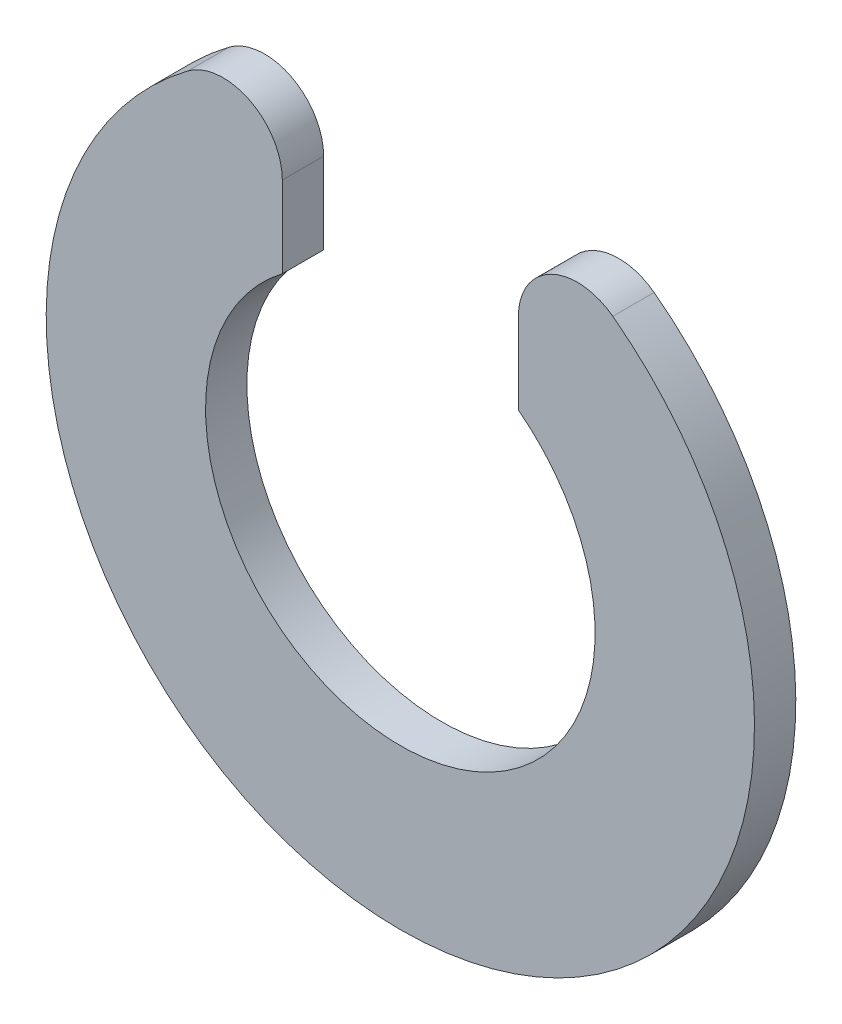
ISO-10303-21;
HEADER;
FILE_DESCRIPTION(('STEP AP214'),'2;1');
FILE_NAME('part.step','',(''),(''),'','','');
FILE_SCHEMA(('AUTOMOTIVE_DESIGN { 1 0 10303 214 1 1 1 1 }'));
ENDSEC;
DATA;
#1=APPLICATION_CONTEXT('core data for automotive mechanical design processes');
#2=APPLICATION_PROTOCOL_DEFINITION('international standard','automotive_design',2000,#1);
#3=PRODUCT_CONTEXT('',#1,'mechanical');
#4=PRODUCT('Part','Part','',(#3));
#5=PRODUCT_RELATED_PRODUCT_CATEGORY('part','',(#4));
#6=PRODUCT_DEFINITION_FORMATION('','',#4);
#7=PRODUCT_DEFINITION_CONTEXT('part definition',#1,'design');
#8=PRODUCT_DEFINITION('design','',#6,#7);
#9=PRODUCT_DEFINITION_SHAPE('','',#8);
#10=(LENGTH_UNIT() NAMED_UNIT(*) SI_UNIT(.MILLI.,.METRE.));
#11=(NAMED_UNIT(*) PLANE_ANGLE_UNIT() SI_UNIT($,.RADIAN.));
#12=(NAMED_UNIT(*) SI_UNIT($,.STERADIAN.) SOLID_ANGLE_UNIT());
#13=UNCERTAINTY_MEASURE_WITH_UNIT(LENGTH_MEASURE(1.E-05),#10,'distance_accuracy_value','');
#14=(GEOMETRIC_REPRESENTATION_CONTEXT(3) GLOBAL_UNCERTAINTY_ASSIGNED_CONTEXT((#13)) GLOBAL_UNIT_ASSIGNED_CONTEXT((#10,
#11,#12)) REPRESENTATION_CONTEXT('',''));
#15=CARTESIAN_POINT('',(0.,0.,0.));
#16=DIRECTION('',(0.,0.,1.));
#17=DIRECTION('',(1.,0.,0.));
#18=AXIS2_PLACEMENT_3D('',#15,#16,#17);
#19=CARTESIAN_POINT('',(0.,0.,0.699999999999999));
#20=DIRECTION('',(0.,0.,1.));
#21=DIRECTION('',(1.,0.,0.));
#22=AXIS2_PLACEMENT_3D('',#19,#20,#21);
#23=PLANE('',#22);
#24=CARTESIAN_POINT('',(0.,0.,0.699999999999999));
#25=DIRECTION('',(0.,0.,1.));
#26=DIRECTION('',(1.,0.,0.));
#27=AXIS2_PLACEMENT_3D('',#24,#25,#26);
#28=CIRCLE('',#27,6.);
#29=CARTESIAN_POINT('',(-3.6,4.8,0.699999999999999));
#30=VERTEX_POINT('',#29);
#31=CARTESIAN_POINT('',(3.6,4.8,0.699999999999999));
#32=VERTEX_POINT('',#31);
#33=EDGE_CURVE('E131',#30,#32,#28,.T.);
#34=ORIENTED_EDGE('',*,*,#33,.T.);
#35=CARTESIAN_POINT('',(3.,4.,0.699999999999999));
#36=DIRECTION('',(0.,0.,1.));
#37=DIRECTION('',(1.,0.,0.));
#38=AXIS2_PLACEMENT_3D('',#35,#36,#37);
#39=CIRCLE('',#38,1.);
#40=CARTESIAN_POINT('',(2.,4.,0.699999999999999));
#41=VERTEX_POINT('',#40);
#42=EDGE_CURVE('E143',#32,#41,#39,.T.);
#43=ORIENTED_EDGE('',*,*,#42,.T.);
#44=DIRECTION('',(0.,1.,0.));
#45=VECTOR('',#44,1.);
#46=CARTESIAN_POINT('',(2.,2.62488094968134,0.699999999999999));
#47=LINE('',#46,#45);
#48=CARTESIAN_POINT('',(2.,2.62488094968134,0.699999999999999));
#49=VERTEX_POINT('',#48);
#50=EDGE_CURVE('E111',#49,#41,#47,.T.);
#51=ORIENTED_EDGE('',*,*,#50,.F.);
#52=CARTESIAN_POINT('',(0.,0.,0.699999999999999));
#53=DIRECTION('',(0.,0.,1.));
#54=DIRECTION('',(1.,0.,0.));
#55=AXIS2_PLACEMENT_3D('',#52,#53,#54);
#56=CIRCLE('',#55,3.3);
#57=CARTESIAN_POINT('',(-2.,2.62488094968134,0.699999999999999));
#58=VERTEX_POINT('',#57);
#59=EDGE_CURVE('E125',#58,#49,#56,.T.);
#60=ORIENTED_EDGE('',*,*,#59,.F.);
#61=DIRECTION('',(0.,-1.,0.));
#62=VECTOR('',#61,1.);
#63=CARTESIAN_POINT('',(-2.,5.65685424949238,0.699999999999999));
#64=LINE('',#63,#62);
#65=CARTESIAN_POINT('',(-2.,4.,0.699999999999999));
#66=VERTEX_POINT('',#65);
#67=EDGE_CURVE('E117',#66,#58,#64,.T.);
#68=ORIENTED_EDGE('',*,*,#67,.F.);
#69=CARTESIAN_POINT('',(-3.,4.,0.699999999999999));
#70=DIRECTION('',(0.,0.,1.));
#71=DIRECTION('',(1.,0.,0.));
#72=AXIS2_PLACEMENT_3D('',#69,#70,#71);
#73=CIRCLE('',#72,1.);
#74=EDGE_CURVE('E141',#66,#30,#73,.T.);
#75=ORIENTED_EDGE('',*,*,#74,.T.);
#76=EDGE_LOOP('',(#34,#43,#51,#60,#68,#75));
#77=FACE_BOUND('',#76,.T.);
#78=ADVANCED_FACE('F50',(#77),#23,.T.);
#79=CARTESIAN_POINT('',(0.,0.,0.));
#80=DIRECTION('',(0.,0.,1.));
#81=DIRECTION('',(1.,0.,0.));
#82=AXIS2_PLACEMENT_3D('',#79,#80,#81);
#83=PLANE('',#82);
#84=DIRECTION('',(0.,1.,0.));
#85=VECTOR('',#84,1.);
#86=CARTESIAN_POINT('',(2.,2.62488094968134,0.));
#87=LINE('',#86,#85);
#88=CARTESIAN_POINT('',(2.,2.62488094968134,0.));
#89=VERTEX_POINT('',#88);
#90=CARTESIAN_POINT('',(2.,4.,0.));
#91=VERTEX_POINT('',#90);
#92=EDGE_CURVE('E110',#89,#91,#87,.T.);
#93=ORIENTED_EDGE('',*,*,#92,.T.);
#94=CARTESIAN_POINT('',(3.,4.,0.));
#95=DIRECTION('',(0.,0.,1.));
#96=DIRECTION('',(1.,0.,0.));
#97=AXIS2_PLACEMENT_3D('',#94,#95,#96);
#98=CIRCLE('',#97,1.);
#99=CARTESIAN_POINT('',(3.6,4.8,0.));
#100=VERTEX_POINT('',#99);
#101=EDGE_CURVE('E58',#91,#100,#98,.F.);
#102=ORIENTED_EDGE('',*,*,#101,.T.);
#103=CARTESIAN_POINT('',(0.,0.,0.));
#104=DIRECTION('',(0.,0.,1.));
#105=DIRECTION('',(1.,0.,0.));
#106=AXIS2_PLACEMENT_3D('',#103,#104,#105);
#107=CIRCLE('',#106,6.);
#108=CARTESIAN_POINT('',(-3.6,4.8,0.));
#109=VERTEX_POINT('',#108);
#110=EDGE_CURVE('E127',#109,#100,#107,.T.);
#111=ORIENTED_EDGE('',*,*,#110,.F.);
#112=CARTESIAN_POINT('',(-3.,4.,0.));
#113=DIRECTION('',(0.,0.,1.));
#114=DIRECTION('',(1.,0.,0.));
#115=AXIS2_PLACEMENT_3D('',#112,#113,#114);
#116=CIRCLE('',#115,1.);
#117=CARTESIAN_POINT('',(-2.,4.,0.));
#118=VERTEX_POINT('',#117);
#119=EDGE_CURVE('E65',#109,#118,#116,.F.);
#120=ORIENTED_EDGE('',*,*,#119,.T.);
#121=DIRECTION('',(0.,-1.,0.));
#122=VECTOR('',#121,1.);
#123=CARTESIAN_POINT('',(-2.,5.65685424949238,0.));
#124=LINE('',#123,#122);
#125=CARTESIAN_POINT('',(-2.,2.62488094968134,0.));
#126=VERTEX_POINT('',#125);
#127=EDGE_CURVE('E103',#118,#126,#124,.T.);
#128=ORIENTED_EDGE('',*,*,#127,.T.);
#129=CARTESIAN_POINT('',(0.,0.,0.));
#130=DIRECTION('',(0.,0.,1.));
#131=DIRECTION('',(1.,0.,0.));
#132=AXIS2_PLACEMENT_3D('',#129,#130,#131);
#133=CIRCLE('',#132,3.3);
#134=EDGE_CURVE('E107',#126,#89,#133,.T.);
#135=ORIENTED_EDGE('',*,*,#134,.T.);
#136=EDGE_LOOP('',(#93,#102,#111,#120,#128,#135));
#137=FACE_BOUND('',#136,.T.);
#138=ADVANCED_FACE('F105',(#137),#83,.F.);
#139=CARTESIAN_POINT('',(0.,0.,0.699999999999999));
#140=DIRECTION('',(0.,0.,-1.));
#141=DIRECTION('',(-1.,0.,0.));
#142=AXIS2_PLACEMENT_3D('',#139,#140,#141);
#143=CYLINDRICAL_SURFACE('',#142,6.);
#144=ORIENTED_EDGE('',*,*,#110,.T.);
#145=DIRECTION('',(0.,0.,-1.));
#146=VECTOR('',#145,1.);
#147=CARTESIAN_POINT('',(3.6,4.8,0.699999999999999));
#148=LINE('',#147,#146);
#149=EDGE_CURVE('E138',#100,#32,#148,.F.);
#150=ORIENTED_EDGE('',*,*,#149,.T.);
#151=ORIENTED_EDGE('',*,*,#33,.F.);
#152=DIRECTION('',(0.,0.,-1.));
#153=VECTOR('',#152,1.);
#154=CARTESIAN_POINT('',(-3.6,4.8,0.699999999999999));
#155=LINE('',#154,#153);
#156=EDGE_CURVE('E134',#30,#109,#155,.T.);
#157=ORIENTED_EDGE('',*,*,#156,.T.);
#158=EDGE_LOOP('',(#144,#150,#151,#157));
#159=FACE_BOUND('',#158,.T.);
#160=ADVANCED_FACE('F150',(#159),#143,.T.);
#161=CARTESIAN_POINT('',(0.,0.,0.699999999999999));
#162=DIRECTION('',(0.,0.,-1.));
#163=DIRECTION('',(-1.,0.,0.));
#164=AXIS2_PLACEMENT_3D('',#161,#162,#163);
#165=CYLINDRICAL_SURFACE('',#164,3.3);
#166=DIRECTION('',(0.,0.,1.));
#167=VECTOR('',#166,1.);
#168=CARTESIAN_POINT('',(2.,2.62488094968134,0.));
#169=LINE('',#168,#167);
#170=EDGE_CURVE('E121',#89,#49,#169,.T.);
#171=ORIENTED_EDGE('',*,*,#170,.F.);
#172=ORIENTED_EDGE('',*,*,#134,.F.);
#173=DIRECTION('',(0.,0.,1.));
#174=VECTOR('',#173,1.);
#175=CARTESIAN_POINT('',(-2.,2.62488094968134,0.));
#176=LINE('',#175,#174);
#177=EDGE_CURVE('E114',#126,#58,#176,.T.);
#178=ORIENTED_EDGE('',*,*,#177,.T.);
#179=ORIENTED_EDGE('',*,*,#59,.T.);
#180=EDGE_LOOP('',(#171,#172,#178,#179));
#181=FACE_BOUND('',#180,.T.);
#182=ADVANCED_FACE('F124',(#181),#165,.F.);
#183=CARTESIAN_POINT('',(-2.,5.65685424949238,0.));
#184=DIRECTION('',(-1.,0.,0.));
#185=DIRECTION('',(0.,-1.,0.));
#186=AXIS2_PLACEMENT_3D('',#183,#184,#185);
#187=PLANE('',#186);
#188=ORIENTED_EDGE('',*,*,#127,.F.);
#189=DIRECTION('',(0.,0.,-1.));
#190=VECTOR('',#189,1.);
#191=CARTESIAN_POINT('',(-2.,4.,0.));
#192=LINE('',#191,#190);
#193=EDGE_CURVE('E13',#118,#66,#192,.F.);
#194=ORIENTED_EDGE('',*,*,#193,.T.);
#195=ORIENTED_EDGE('',*,*,#67,.T.);
#196=ORIENTED_EDGE('',*,*,#177,.F.);
#197=EDGE_LOOP('',(#188,#194,#195,#196));
#198=FACE_BOUND('',#197,.T.);
#199=ADVANCED_FACE('F115',(#198),#187,.F.);
#200=CARTESIAN_POINT('',(2.,2.62488094968134,0.));
#201=DIRECTION('',(1.,0.,0.));
#202=DIRECTION('',(0.,1.,0.));
#203=AXIS2_PLACEMENT_3D('',#200,#201,#202);
#204=PLANE('',#203);
#205=ORIENTED_EDGE('',*,*,#50,.T.);
#206=DIRECTION('',(0.,0.,-1.));
#207=VECTOR('',#206,1.);
#208=CARTESIAN_POINT('',(2.,4.,0.));
#209=LINE('',#208,#207);
#210=EDGE_CURVE('E73',#41,#91,#209,.T.);
#211=ORIENTED_EDGE('',*,*,#210,.T.);
#212=ORIENTED_EDGE('',*,*,#92,.F.);
#213=ORIENTED_EDGE('',*,*,#170,.T.);
#214=EDGE_LOOP('',(#205,#211,#212,#213));
#215=FACE_BOUND('',#214,.T.);
#216=ADVANCED_FACE('F156',(#215),#204,.F.);
#217=CARTESIAN_POINT('',(3.,4.,0.699999999999999));
#218=DIRECTION('',(0.,0.,-1.));
#219=DIRECTION('',(-1.,0.,0.));
#220=AXIS2_PLACEMENT_3D('',#217,#218,#219);
#221=CYLINDRICAL_SURFACE('',#220,1.);
#222=ORIENTED_EDGE('',*,*,#101,.F.);
#223=ORIENTED_EDGE('',*,*,#210,.F.);
#224=ORIENTED_EDGE('',*,*,#42,.F.);
#225=ORIENTED_EDGE('',*,*,#149,.F.);
#226=EDGE_LOOP('',(#222,#223,#224,#225));
#227=FACE_BOUND('',#226,.T.);
#228=ADVANCED_FACE('F153',(#227),#221,.T.);
#229=CARTESIAN_POINT('',(-3.,4.,0.699999999999999));
#230=DIRECTION('',(0.,0.,-1.));
#231=DIRECTION('',(-1.,0.,0.));
#232=AXIS2_PLACEMENT_3D('',#229,#230,#231);
#233=CYLINDRICAL_SURFACE('',#232,1.);
#234=ORIENTED_EDGE('',*,*,#119,.F.);
#235=ORIENTED_EDGE('',*,*,#156,.F.);
#236=ORIENTED_EDGE('',*,*,#74,.F.);
#237=ORIENTED_EDGE('',*,*,#193,.F.);
#238=EDGE_LOOP('',(#234,#235,#236,#237));
#239=FACE_BOUND('',#238,.T.);
#240=ADVANCED_FACE('F52',(#239),#233,.T.);
#241=CLOSED_SHELL('',(#78,#138,#160,#182,#199,#216,#228,#240));
#242=MANIFOLD_SOLID_BREP('B2',#241);
#243=ADVANCED_BREP_SHAPE_REPRESENTATION('',(#18,#242),#14);
#244=SHAPE_DEFINITION_REPRESENTATION(#9,#243);
ENDSEC;
END-ISO-10303-21;
